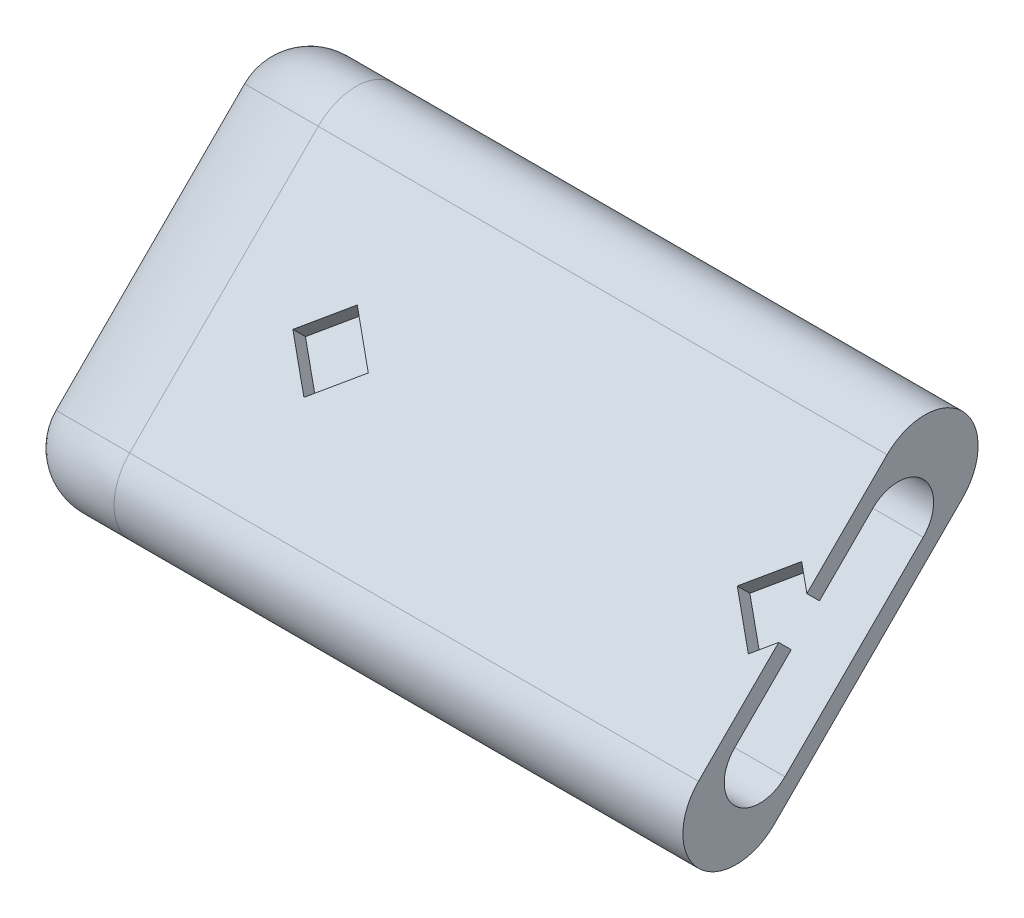
ISO-10303-21;
HEADER;
FILE_DESCRIPTION(('STEP AP214'),'2;1');
FILE_NAME('part.step','',(''),(''),'','','');
FILE_SCHEMA(('AUTOMOTIVE_DESIGN { 1 0 10303 214 1 1 1 1 }'));
ENDSEC;
DATA;
#1=APPLICATION_CONTEXT('core data for automotive mechanical design processes');
#2=APPLICATION_PROTOCOL_DEFINITION('international standard','automotive_design',2000,#1);
#3=PRODUCT_CONTEXT('',#1,'mechanical');
#4=PRODUCT('Part','Part','',(#3));
#5=PRODUCT_RELATED_PRODUCT_CATEGORY('part','',(#4));
#6=PRODUCT_DEFINITION_FORMATION('','',#4);
#7=PRODUCT_DEFINITION_CONTEXT('part definition',#1,'design');
#8=PRODUCT_DEFINITION('design','',#6,#7);
#9=PRODUCT_DEFINITION_SHAPE('','',#8);
#10=(LENGTH_UNIT() NAMED_UNIT(*) SI_UNIT(.MILLI.,.METRE.));
#11=(NAMED_UNIT(*) PLANE_ANGLE_UNIT() SI_UNIT($,.RADIAN.));
#12=(NAMED_UNIT(*) SI_UNIT($,.STERADIAN.) SOLID_ANGLE_UNIT());
#13=UNCERTAINTY_MEASURE_WITH_UNIT(LENGTH_MEASURE(1.E-05),#10,'distance_accuracy_value','');
#14=(GEOMETRIC_REPRESENTATION_CONTEXT(3) GLOBAL_UNCERTAINTY_ASSIGNED_CONTEXT((#13)) GLOBAL_UNIT_ASSIGNED_CONTEXT((#10,
#11,#12)) REPRESENTATION_CONTEXT('',''));
#15=CARTESIAN_POINT('',(0.,0.,0.));
#16=DIRECTION('',(0.,0.,1.));
#17=DIRECTION('',(1.,0.,0.));
#18=AXIS2_PLACEMENT_3D('',#15,#16,#17);
#19=CARTESIAN_POINT('',(17.5,38.138785920236,59.1752126605359));
#20=DIRECTION('',(0.,-0.707106781186547,-0.707106781186548));
#21=DIRECTION('',(0.,0.707106781186548,-0.707106781186547));
#22=AXIS2_PLACEMENT_3D('',#19,#20,#21);
#23=PLANE('',#22);
#24=DIRECTION('',(0.707106781186548,-0.5,0.499999999999999));
#25=VECTOR('',#24,1.);
#26=CARTESIAN_POINT('',(25.3786796564404,48.7453876380342,48.5686109427377));
#27=LINE('',#26,#25);
#28=CARTESIAN_POINT('',(25.3786796564404,48.7453876380342,48.5686109427377));
#29=VERTEX_POINT('',#28);
#30=CARTESIAN_POINT('',(27.5,47.2453876380342,50.0686109427377));
#31=VERTEX_POINT('',#30);
#32=EDGE_CURVE('E375',#29,#31,#27,.T.);
#33=ORIENTED_EDGE('',*,*,#32,.F.);
#34=DIRECTION('',(-0.707106781186547,-0.500000000000001,0.5));
#35=VECTOR('',#34,1.);
#36=CARTESIAN_POINT('',(27.5,50.2453876380342,47.0686109427377));
#37=LINE('',#36,#35);
#38=CARTESIAN_POINT('',(27.5,50.2453876380342,47.0686109427377));
#39=VERTEX_POINT('',#38);
#40=EDGE_CURVE('E418',#39,#29,#37,.T.);
#41=ORIENTED_EDGE('',*,*,#40,.F.);
#42=DIRECTION('',(-0.707106781186547,0.5,-0.5));
#43=VECTOR('',#42,1.);
#44=CARTESIAN_POINT('',(29.6213203435596,48.7453876380342,48.5686109427377));
#45=LINE('',#44,#43);
#46=CARTESIAN_POINT('',(29.6213203435596,48.7453876380342,48.5686109427377));
#47=VERTEX_POINT('',#46);
#48=EDGE_CURVE('E420',#47,#39,#45,.T.);
#49=ORIENTED_EDGE('',*,*,#48,.F.);
#50=DIRECTION('',(0.707106781186547,0.500000000000001,-0.5));
#51=VECTOR('',#50,1.);
#52=CARTESIAN_POINT('',(27.5,47.2453876380342,50.0686109427377));
#53=LINE('',#52,#51);
#54=EDGE_CURVE('E223',#31,#47,#53,.T.);
#55=ORIENTED_EDGE('',*,*,#54,.F.);
#56=EDGE_LOOP('',(#33,#41,#49,#55));
#57=FACE_BOUND('',#56,.T.);
#58=DIRECTION('',(1.,0.,0.));
#59=VECTOR('',#58,1.);
#60=CARTESIAN_POINT('',(21.5,54.0486884969333,43.2653100838386));
#61=LINE('',#60,#59);
#62=CARTESIAN_POINT('',(21.5,54.0486884969334,43.2653100838386));
#63=VERTEX_POINT('',#62);
#64=CARTESIAN_POINT('',(53.5,54.0486884969333,43.2653100838386));
#65=VERTEX_POINT('',#64);
#66=EDGE_CURVE('E385',#63,#65,#61,.T.);
#67=ORIENTED_EDGE('',*,*,#66,.F.);
#68=DIRECTION('',(0.,-0.707106781186548,0.707106781186547));
#69=VECTOR('',#68,1.);
#70=CARTESIAN_POINT('',(21.5,54.0486884969333,43.2653100838386));
#71=LINE('',#70,#69);
#72=CARTESIAN_POINT('',(21.5,43.4420867791351,53.8719118016368));
#73=VERTEX_POINT('',#72);
#74=EDGE_CURVE('E11',#63,#73,#71,.T.);
#75=ORIENTED_EDGE('',*,*,#74,.T.);
#76=DIRECTION('',(1.,0.,0.));
#77=VECTOR('',#76,1.);
#78=CARTESIAN_POINT('',(21.5,43.4420867791351,53.8719118016368));
#79=LINE('',#78,#77);
#80=CARTESIAN_POINT('',(53.5,43.4420867791351,53.8719118016368));
#81=VERTEX_POINT('',#80);
#82=EDGE_CURVE('E45',#73,#81,#79,.T.);
#83=ORIENTED_EDGE('',*,*,#82,.T.);
#84=DIRECTION('',(0.,-0.707106781186548,0.707106781186547));
#85=VECTOR('',#84,1.);
#86=CARTESIAN_POINT('',(53.5,54.0486884969333,43.2653100838386));
#87=LINE('',#86,#85);
#88=CARTESIAN_POINT('',(53.5,47.9524944192208,49.3615041615511));
#89=VERTEX_POINT('',#88);
#90=EDGE_CURVE('E53',#89,#81,#87,.T.);
#91=ORIENTED_EDGE('',*,*,#90,.F.);
#92=DIRECTION('',(0.707106781186547,0.500000000000001,-0.5));
#93=VECTOR('',#92,1.);
#94=CARTESIAN_POINT('',(52.5,47.2453876380342,50.0686109427377));
#95=LINE('',#94,#93);
#96=CARTESIAN_POINT('',(52.5,47.2453876380342,50.0686109427377));
#97=VERTEX_POINT('',#96);
#98=EDGE_CURVE('E40',#97,#89,#95,.T.);
#99=ORIENTED_EDGE('',*,*,#98,.F.);
#100=DIRECTION('',(0.707106781186546,-0.500000000000001,0.500000000000001));
#101=VECTOR('',#100,1.);
#102=CARTESIAN_POINT('',(50.3786796564404,48.7453876380342,48.5686109427377));
#103=LINE('',#102,#101);
#104=CARTESIAN_POINT('',(50.3786796564404,48.7453876380342,48.5686109427377));
#105=VERTEX_POINT('',#104);
#106=EDGE_CURVE('E423',#105,#97,#103,.T.);
#107=ORIENTED_EDGE('',*,*,#106,.F.);
#108=DIRECTION('',(-0.707106781186548,-0.5,0.499999999999999));
#109=VECTOR('',#108,1.);
#110=CARTESIAN_POINT('',(52.5,50.2453876380342,47.0686109427377));
#111=LINE('',#110,#109);
#112=CARTESIAN_POINT('',(52.5,50.2453876380342,47.0686109427377));
#113=VERTEX_POINT('',#112);
#114=EDGE_CURVE('E425',#113,#105,#111,.T.);
#115=ORIENTED_EDGE('',*,*,#114,.F.);
#116=DIRECTION('',(-0.707106781186548,0.5,-0.5));
#117=VECTOR('',#116,1.);
#118=CARTESIAN_POINT('',(54.6213203435596,48.7453876380342,48.5686109427377));
#119=LINE('',#118,#117);
#120=CARTESIAN_POINT('',(53.5,49.5382808568477,47.7757177239242));
#121=VERTEX_POINT('',#120);
#122=EDGE_CURVE('E426',#121,#113,#119,.T.);
#123=ORIENTED_EDGE('',*,*,#122,.F.);
#124=EDGE_CURVE('E380',#65,#121,#87,.T.);
#125=ORIENTED_EDGE('',*,*,#124,.F.);
#126=EDGE_LOOP('',(#67,#75,#83,#91,#99,#107,#115,#123,#125));
#127=FACE_BOUND('',#126,.T.);
#128=ADVANCED_FACE('F37',(#57,#127),#23,.F.);
#129=CARTESIAN_POINT('',(16.5,-6.03087227902122,1.74730231817738));
#130=DIRECTION('',(0.,0.707106781186547,0.707106781186548));
#131=DIRECTION('',(0.,-0.707106781186548,0.707106781186547));
#132=AXIS2_PLACEMENT_3D('',#129,#130,#131);
#133=CYLINDRICAL_SURFACE('',#132,1.99999999975565);
#134=DIRECTION('',(0.,0.707106781186547,0.707106781186548));
#135=VECTOR('',#134,1.);
#136=CARTESIAN_POINT('',(18.4999999995113,-6.03087227850288,1.74730231765905));
#137=LINE('',#136,#135);
#138=CARTESIAN_POINT('',(18.4999999995113,12.9481068389103,20.7262814350723));
#139=VERTEX_POINT('',#138);
#140=CARTESIAN_POINT('',(18.4999999997556,39.1110577428126,46.8892323389746));
#141=VERTEX_POINT('',#140);
#142=EDGE_CURVE('E284',#139,#141,#137,.T.);
#143=ORIENTED_EDGE('',*,*,#142,.F.);
#144=CARTESIAN_POINT('',(16.5,12.948106838392,20.7262814355906));
#145=DIRECTION('',(0.,0.707106781186547,0.707106781186548));
#146=DIRECTION('',(0.,-0.707106781186548,0.707106781186547));
#147=AXIS2_PLACEMENT_3D('',#144,#145,#146);
#148=CIRCLE('',#147,1.99999999975565);
#149=CARTESIAN_POINT('',(14.5,12.9481068389103,20.7262814350723));
#150=VERTEX_POINT('',#149);
#151=EDGE_CURVE('E299',#139,#150,#148,.F.);
#152=ORIENTED_EDGE('',*,*,#151,.T.);
#153=DIRECTION('',(0.,0.707106781186547,0.707106781186548));
#154=VECTOR('',#153,1.);
#155=CARTESIAN_POINT('',(14.5,-6.03087227850288,1.74730231765905));
#156=LINE('',#155,#154);
#157=CARTESIAN_POINT('',(14.5000000002443,39.1110577428126,46.8892323389746));
#158=VERTEX_POINT('',#157);
#159=EDGE_CURVE('E275',#150,#158,#156,.T.);
#160=ORIENTED_EDGE('',*,*,#159,.T.);
#161=CARTESIAN_POINT('',(16.5,39.1110577422943,46.8892323394929));
#162=DIRECTION('',(0.,0.707106781186547,0.707106781186548));
#163=DIRECTION('',(0.,-0.707106781186548,0.707106781186547));
#164=AXIS2_PLACEMENT_3D('',#161,#162,#163);
#165=CIRCLE('',#164,1.99999999975565);
#166=EDGE_CURVE('E287',#141,#158,#165,.F.);
#167=ORIENTED_EDGE('',*,*,#166,.F.);
#168=EDGE_LOOP('',(#143,#152,#160,#167));
#169=FACE_BOUND('',#168,.T.);
#170=ADVANCED_FACE('F475',(#169),#133,.F.);
#171=CARTESIAN_POINT('',(18.4999999995113,-6.03087227850288,1.74730231765905));
#172=DIRECTION('',(1.,-3.14145615637227E-11,3.14145615637227E-11));
#173=DIRECTION('',(3.14145615637227E-11,1.,0.));
#174=AXIS2_PLACEMENT_3D('',#171,#172,#173);
#175=PLANE('',#174);
#176=DIRECTION('',(0.,0.707106781186547,0.707106781186548));
#177=VECTOR('',#176,1.);
#178=CARTESIAN_POINT('',(18.5,1.74730231610411,-6.03087227694793));
#179=LINE('',#178,#177);
#180=CARTESIAN_POINT('',(18.5,20.7262814335173,12.9481068404653));
#181=VERTEX_POINT('',#180);
#182=CARTESIAN_POINT('',(18.5,46.8892323374196,39.1110577443676));
#183=VERTEX_POINT('',#182);
#184=EDGE_CURVE('E288',#181,#183,#179,.T.);
#185=ORIENTED_EDGE('',*,*,#184,.F.);
#186=DIRECTION('',(-4.44268990194212E-11,-0.707106781186548,0.707106781186547));
#187=VECTOR('',#186,1.);
#188=CARTESIAN_POINT('',(18.4999999995113,12.9481068389103,20.7262814350723));
#189=LINE('',#188,#187);
#190=EDGE_CURVE('E267',#181,#139,#189,.T.);
#191=ORIENTED_EDGE('',*,*,#190,.T.);
#192=ORIENTED_EDGE('',*,*,#142,.T.);
#193=DIRECTION('',(2.22132918075765E-11,0.707106781186548,-0.707106781186547));
#194=VECTOR('',#193,1.);
#195=CARTESIAN_POINT('',(18.4999999997556,39.1110577428126,46.8892323389746));
#196=LINE('',#195,#194);
#197=EDGE_CURVE('E324',#183,#141,#196,.F.);
#198=ORIENTED_EDGE('',*,*,#197,.F.);
#199=EDGE_LOOP('',(#185,#191,#192,#198));
#200=FACE_BOUND('',#199,.T.);
#201=ADVANCED_FACE('F473',(#200),#175,.F.);
#202=CARTESIAN_POINT('',(16.5,1.74730231610411,-6.03087227694793));
#203=DIRECTION('',(0.,0.707106781186547,0.707106781186548));
#204=DIRECTION('',(0.,-0.707106781186548,0.707106781186547));
#205=AXIS2_PLACEMENT_3D('',#202,#203,#204);
#206=CYLINDRICAL_SURFACE('',#205,2.);
#207=DIRECTION('',(0.,0.707106781186547,0.707106781186548));
#208=VECTOR('',#207,1.);
#209=CARTESIAN_POINT('',(14.5,1.74730231610423,-6.03087227694805));
#210=LINE('',#209,#208);
#211=CARTESIAN_POINT('',(14.5,20.7262814335175,12.9481068404652));
#212=VERTEX_POINT('',#211);
#213=CARTESIAN_POINT('',(14.5,46.8892323374197,39.1110577443675));
#214=VERTEX_POINT('',#213);
#215=EDGE_CURVE('E291',#212,#214,#210,.T.);
#216=ORIENTED_EDGE('',*,*,#215,.F.);
#217=CARTESIAN_POINT('',(16.5,20.7262814335173,12.9481068404653));
#218=DIRECTION('',(0.,0.707106781186547,0.707106781186548));
#219=DIRECTION('',(0.,-0.707106781186548,0.707106781186547));
#220=AXIS2_PLACEMENT_3D('',#217,#218,#219);
#221=CIRCLE('',#220,2.);
#222=EDGE_CURVE('E303',#212,#181,#221,.F.);
#223=ORIENTED_EDGE('',*,*,#222,.T.);
#224=ORIENTED_EDGE('',*,*,#184,.T.);
#225=CARTESIAN_POINT('',(16.5,46.8892323374196,39.1110577443676));
#226=DIRECTION('',(0.,0.707106781186547,0.707106781186548));
#227=DIRECTION('',(0.,-0.707106781186548,0.707106781186547));
#228=AXIS2_PLACEMENT_3D('',#225,#226,#227);
#229=CIRCLE('',#228,2.);
#230=EDGE_CURVE('E327',#214,#183,#229,.F.);
#231=ORIENTED_EDGE('',*,*,#230,.F.);
#232=EDGE_LOOP('',(#216,#223,#224,#231));
#233=FACE_BOUND('',#232,.T.);
#234=ADVANCED_FACE('F481',(#233),#206,.F.);
#235=CARTESIAN_POINT('',(14.5,1.74730231610423,-6.03087227694805));
#236=DIRECTION('',(-1.,0.,0.));
#237=DIRECTION('',(0.,-1.,0.));
#238=AXIS2_PLACEMENT_3D('',#235,#236,#237);
#239=PLANE('',#238);
#240=ORIENTED_EDGE('',*,*,#159,.F.);
#241=DIRECTION('',(0.,0.707106781186548,-0.707106781186547));
#242=VECTOR('',#241,1.);
#243=CARTESIAN_POINT('',(14.5,20.7262814335174,12.9481068404652));
#244=LINE('',#243,#242);
#245=EDGE_CURVE('E306',#150,#212,#244,.T.);
#246=ORIENTED_EDGE('',*,*,#245,.T.);
#247=ORIENTED_EDGE('',*,*,#215,.T.);
#248=DIRECTION('',(2.22132918075761E-11,-0.707106781186548,0.707106781186547));
#249=VECTOR('',#248,1.);
#250=CARTESIAN_POINT('',(14.5,46.8892323374197,39.1110577443675));
#251=LINE('',#250,#249);
#252=EDGE_CURVE('E315',#158,#214,#251,.F.);
#253=ORIENTED_EDGE('',*,*,#252,.F.);
#254=EDGE_LOOP('',(#240,#246,#247,#253));
#255=FACE_BOUND('',#254,.T.);
#256=ADVANCED_FACE('F478',(#255),#239,.F.);
#257=CARTESIAN_POINT('',(19.5,22.2288833435387,11.4455049304439));
#258=DIRECTION('',(1.,0.,0.));
#259=DIRECTION('',(0.,1.,0.));
#260=AXIS2_PLACEMENT_3D('',#257,#258,#259);
#261=PLANE('',#260);
#262=DIRECTION('',(0.,0.707106781186548,-0.707106781186547));
#263=VECTOR('',#262,1.);
#264=CARTESIAN_POINT('',(19.5,37.7852325296428,48.2150575521444));
#265=LINE('',#264,#263);
#266=CARTESIAN_POINT('',(19.5,37.7852325296428,48.2150575521444));
#267=VERTEX_POINT('',#266);
#268=CARTESIAN_POINT('',(19.5,48.391834247441,37.6084558343462));
#269=VERTEX_POINT('',#268);
#270=EDGE_CURVE('E321',#267,#269,#265,.T.);
#271=ORIENTED_EDGE('',*,*,#270,.F.);
#272=DIRECTION('',(0.,0.707106781186547,0.707106781186548));
#273=VECTOR('',#272,1.);
#274=CARTESIAN_POINT('',(19.5,-7.3566974916727,3.07312753082887));
#275=LINE('',#274,#273);
#276=CARTESIAN_POINT('',(19.5,11.6222816257405,22.0521066482421));
#277=VERTEX_POINT('',#276);
#278=EDGE_CURVE('E279',#277,#267,#275,.T.);
#279=ORIENTED_EDGE('',*,*,#278,.F.);
#280=DIRECTION('',(0.,-0.707106781186548,0.707106781186547));
#281=VECTOR('',#280,1.);
#282=CARTESIAN_POINT('',(19.5,22.2288833435387,11.4455049304439));
#283=LINE('',#282,#281);
#284=CARTESIAN_POINT('',(19.5,22.2288833435387,11.4455049304439));
#285=VERTEX_POINT('',#284);
#286=EDGE_CURVE('E298',#285,#277,#283,.T.);
#287=ORIENTED_EDGE('',*,*,#286,.F.);
#288=DIRECTION('',(0.,0.707106781186547,0.707106781186548));
#289=VECTOR('',#288,1.);
#290=CARTESIAN_POINT('',(19.5,3.24990422612552,-7.53347418696933));
#291=LINE('',#290,#289);
#292=EDGE_CURVE('E270',#285,#269,#291,.T.);
#293=ORIENTED_EDGE('',*,*,#292,.T.);
#294=EDGE_LOOP('',(#271,#279,#287,#293));
#295=FACE_BOUND('',#294,.T.);
#296=ADVANCED_FACE('F485',(#295),#261,.T.);
#297=CARTESIAN_POINT('',(14.5,11.5338932780922,22.1404949958904));
#298=DIRECTION('',(0.,0.707106781186547,0.707106781186548));
#299=DIRECTION('',(1.,0.,0.));
#300=AXIS2_PLACEMENT_3D('',#297,#298,#299);
#301=PLANE('',#300);
#302=CARTESIAN_POINT('',(16.5,22.2288833435387,11.4455049304439));
#303=DIRECTION('',(0.,0.707106781186547,0.707106781186548));
#304=DIRECTION('',(0.,-0.707106781186548,0.707106781186547));
#305=AXIS2_PLACEMENT_3D('',#302,#303,#304);
#306=CIRCLE('',#305,3.);
#307=CARTESIAN_POINT('',(13.5,22.2288833435387,11.4455049304439));
#308=VERTEX_POINT('',#307);
#309=EDGE_CURVE('E296',#308,#285,#306,.F.);
#310=ORIENTED_EDGE('',*,*,#309,.T.);
#311=ORIENTED_EDGE('',*,*,#286,.T.);
#312=CARTESIAN_POINT('',(16.5,11.6222816257405,22.0521066482421));
#313=DIRECTION('',(0.,0.707106781186547,0.707106781186548));
#314=DIRECTION('',(0.,-0.707106781186548,0.707106781186547));
#315=AXIS2_PLACEMENT_3D('',#312,#313,#314);
#316=CIRCLE('',#315,3.);
#317=CARTESIAN_POINT('',(13.5,11.6222816257405,22.0521066482421));
#318=VERTEX_POINT('',#317);
#319=EDGE_CURVE('E271',#277,#318,#316,.F.);
#320=ORIENTED_EDGE('',*,*,#319,.T.);
#321=DIRECTION('',(0.,0.707106781186548,-0.707106781186547));
#322=VECTOR('',#321,1.);
#323=CARTESIAN_POINT('',(13.5,22.2288833435387,11.4455049304439));
#324=LINE('',#323,#322);
#325=EDGE_CURVE('E266',#318,#308,#324,.T.);
#326=ORIENTED_EDGE('',*,*,#325,.T.);
#327=EDGE_LOOP('',(#310,#311,#320,#326));
#328=FACE_BOUND('',#327,.T.);
#329=ORIENTED_EDGE('',*,*,#190,.F.);
#330=ORIENTED_EDGE('',*,*,#222,.F.);
#331=ORIENTED_EDGE('',*,*,#245,.F.);
#332=ORIENTED_EDGE('',*,*,#151,.F.);
#333=EDGE_LOOP('',(#329,#330,#331,#332));
#334=FACE_BOUND('',#333,.T.);
#335=ADVANCED_FACE('F483',(#328,#334),#301,.F.);
#336=CARTESIAN_POINT('',(21.5,39.1110577422942,46.8892323394929));
#337=DIRECTION('',(0.,0.707106781186548,-0.707106781186547));
#338=DIRECTION('',(0.,0.707106781186547,0.707106781186548));
#339=AXIS2_PLACEMENT_3D('',#336,#337,#338);
#340=TOROIDAL_SURFACE('',#339,5.,1.99999999975565);
#341=CARTESIAN_POINT('',(21.5,39.1110577428126,46.8892323389746));
#342=DIRECTION('',(0.,0.707106781186548,-0.707106781186547));
#343=DIRECTION('',(-1.,0.,0.));
#344=AXIS2_PLACEMENT_3D('',#341,#342,#343);
#345=CIRCLE('',#344,3.00000000024435);
#346=CARTESIAN_POINT('',(21.5,41.232378086545,49.010552682707));
#347=VERTEX_POINT('',#346);
#348=EDGE_CURVE('E365',#141,#347,#345,.T.);
#349=ORIENTED_EDGE('',*,*,#348,.F.);
#350=ORIENTED_EDGE('',*,*,#166,.T.);
#351=CARTESIAN_POINT('',(21.5,39.1110577428126,46.8892323389746));
#352=DIRECTION('',(0.,0.707106781186548,-0.707106781186547));
#353=DIRECTION('',(-1.,0.,0.));
#354=AXIS2_PLACEMENT_3D('',#351,#352,#353);
#355=CIRCLE('',#354,6.99999999975565);
#356=CARTESIAN_POINT('',(21.5,44.0608052109456,51.8389798071076));
#357=VERTEX_POINT('',#356);
#358=EDGE_CURVE('E336',#158,#357,#355,.T.);
#359=ORIENTED_EDGE('',*,*,#358,.T.);
#360=CARTESIAN_POINT('',(21.5,42.646591648227,50.4247662454256));
#361=DIRECTION('',(1.,0.,0.));
#362=DIRECTION('',(0.,-0.707106781186548,0.707106781186547));
#363=AXIS2_PLACEMENT_3D('',#360,#361,#362);
#364=CIRCLE('',#363,1.99999999975565);
#365=EDGE_CURVE('E352',#347,#357,#364,.F.);
#366=ORIENTED_EDGE('',*,*,#365,.F.);
#367=EDGE_LOOP('',(#349,#350,#359,#366));
#368=FACE_BOUND('',#367,.T.);
#369=ADVANCED_FACE('F467',(#368),#340,.F.);
#370=CARTESIAN_POINT('',(21.5,41.8793807927129,44.1209092890743));
#371=DIRECTION('',(0.,0.707106781186548,-0.707106781186547));
#372=DIRECTION('',(0.,0.707106781186547,0.707106781186548));
#373=AXIS2_PLACEMENT_3D('',#370,#371,#372);
#374=CYLINDRICAL_SURFACE('',#373,3.00000000012217);
#375=CARTESIAN_POINT('',(21.5,46.8892323374196,39.1110577443676));
#376=DIRECTION('',(0.,0.707106781186548,-0.707106781186547));
#377=DIRECTION('',(-1.,0.,0.));
#378=AXIS2_PLACEMENT_3D('',#375,#376,#377);
#379=CIRCLE('',#378,3.);
#380=CARTESIAN_POINT('',(21.5,49.0105526809792,41.2323780879272));
#381=VERTEX_POINT('',#380);
#382=EDGE_CURVE('E355',#183,#381,#379,.T.);
#383=ORIENTED_EDGE('',*,*,#382,.F.);
#384=ORIENTED_EDGE('',*,*,#197,.T.);
#385=ORIENTED_EDGE('',*,*,#348,.T.);
#386=DIRECTION('',(0.,0.707106781170841,-0.707106781202254));
#387=VECTOR('',#386,1.);
#388=CARTESIAN_POINT('',(21.5,41.232378086545,49.010552682707));
#389=LINE('',#388,#387);
#390=EDGE_CURVE('E357',#381,#347,#389,.F.);
#391=ORIENTED_EDGE('',*,*,#390,.F.);
#392=EDGE_LOOP('',(#383,#384,#385,#391));
#393=FACE_BOUND('',#392,.T.);
#394=ADVANCED_FACE('F465',(#393),#374,.T.);
#395=CARTESIAN_POINT('',(21.5,46.8892323374196,39.1110577443676));
#396=DIRECTION('',(0.,0.707106781186548,-0.707106781186547));
#397=DIRECTION('',(0.,0.707106781186547,0.707106781186548));
#398=AXIS2_PLACEMENT_3D('',#395,#396,#397);
#399=TOROIDAL_SURFACE('',#398,5.,2.);
#400=CARTESIAN_POINT('',(21.5,46.8892323374197,39.1110577443675));
#401=DIRECTION('',(0.,0.707106781186548,-0.707106781186547));
#402=DIRECTION('',(-1.,0.,0.));
#403=AXIS2_PLACEMENT_3D('',#400,#401,#402);
#404=CIRCLE('',#403,7.);
#405=CARTESIAN_POINT('',(21.5,51.8389798057255,44.0608052126733));
#406=VERTEX_POINT('',#405);
#407=EDGE_CURVE('E335',#214,#406,#404,.T.);
#408=ORIENTED_EDGE('',*,*,#407,.F.);
#409=ORIENTED_EDGE('',*,*,#230,.T.);
#410=ORIENTED_EDGE('',*,*,#382,.T.);
#411=CARTESIAN_POINT('',(21.5,50.4247662433523,42.6465916503003));
#412=DIRECTION('',(1.,0.,0.));
#413=DIRECTION('',(0.,-0.707106781186548,0.707106781186547));
#414=AXIS2_PLACEMENT_3D('',#411,#412,#413);
#415=CIRCLE('',#414,2.);
#416=EDGE_CURVE('E338',#406,#381,#415,.F.);
#417=ORIENTED_EDGE('',*,*,#416,.F.);
#418=EDGE_LOOP('',(#408,#409,#410,#417));
#419=FACE_BOUND('',#418,.T.);
#420=ADVANCED_FACE('F457',(#419),#399,.F.);
#421=CARTESIAN_POINT('',(21.5,41.8793807927129,44.1209092890743));
#422=DIRECTION('',(0.,0.707106781186548,-0.707106781186547));
#423=DIRECTION('',(0.,0.707106781186547,0.707106781186548));
#424=AXIS2_PLACEMENT_3D('',#421,#422,#423);
#425=CYLINDRICAL_SURFACE('',#424,6.99999999987782);
#426=ORIENTED_EDGE('',*,*,#358,.F.);
#427=ORIENTED_EDGE('',*,*,#252,.T.);
#428=ORIENTED_EDGE('',*,*,#407,.T.);
#429=DIRECTION('',(0.,-0.707106781202255,0.70710678117084));
#430=VECTOR('',#429,1.);
#431=CARTESIAN_POINT('',(21.5,51.8389798057255,44.0608052126733));
#432=LINE('',#431,#430);
#433=EDGE_CURVE('E332',#357,#406,#432,.F.);
#434=ORIENTED_EDGE('',*,*,#433,.F.);
#435=EDGE_LOOP('',(#426,#427,#428,#434));
#436=FACE_BOUND('',#435,.T.);
#437=ADVANCED_FACE('F449',(#436),#425,.F.);
#438=CARTESIAN_POINT('',(16.5,3.24990422612552,-7.53347418696933));
#439=DIRECTION('',(0.,0.707106781186547,0.707106781186548));
#440=DIRECTION('',(0.,-0.707106781186548,0.707106781186547));
#441=AXIS2_PLACEMENT_3D('',#438,#439,#440);
#442=CYLINDRICAL_SURFACE('',#441,3.);
#443=ORIENTED_EDGE('',*,*,#309,.F.);
#444=DIRECTION('',(0.,0.707106781186547,0.707106781186548));
#445=VECTOR('',#444,1.);
#446=CARTESIAN_POINT('',(13.5,3.24990422612551,-7.53347418696933));
#447=LINE('',#446,#445);
#448=CARTESIAN_POINT('',(13.5,48.391834247441,37.6084558343462));
#449=VERTEX_POINT('',#448);
#450=EDGE_CURVE('E272',#308,#449,#447,.T.);
#451=ORIENTED_EDGE('',*,*,#450,.T.);
#452=CARTESIAN_POINT('',(16.5,48.391834247441,37.6084558343462));
#453=DIRECTION('',(0.,0.707106781186547,0.707106781186548));
#454=DIRECTION('',(0.,-0.707106781186548,0.707106781186547));
#455=AXIS2_PLACEMENT_3D('',#452,#453,#454);
#456=CIRCLE('',#455,3.);
#457=EDGE_CURVE('E318',#269,#449,#456,.T.);
#458=ORIENTED_EDGE('',*,*,#457,.F.);
#459=ORIENTED_EDGE('',*,*,#292,.F.);
#460=EDGE_LOOP('',(#443,#451,#458,#459));
#461=FACE_BOUND('',#460,.T.);
#462=ADVANCED_FACE('F554',(#461),#442,.T.);
#463=CARTESIAN_POINT('',(21.5,41.8793807927129,44.1209092890743));
#464=DIRECTION('',(0.,0.707106781186548,-0.707106781186547));
#465=DIRECTION('',(0.,0.707106781186547,0.707106781186548));
#466=AXIS2_PLACEMENT_3D('',#463,#464,#465);
#467=CYLINDRICAL_SURFACE('',#466,2.);
#468=CARTESIAN_POINT('',(21.5,48.391834247441,37.6084558343462));
#469=DIRECTION('',(0.,0.707106781186548,-0.707106781186547));
#470=DIRECTION('',(-1.,0.,0.));
#471=AXIS2_PLACEMENT_3D('',#468,#469,#470);
#472=CIRCLE('',#471,2.);
#473=CARTESIAN_POINT('',(21.5,49.8060478098141,39.0226693967193));
#474=VERTEX_POINT('',#473);
#475=EDGE_CURVE('E391',#269,#474,#472,.T.);
#476=ORIENTED_EDGE('',*,*,#475,.T.);
#477=DIRECTION('',(0.,0.707106781186548,-0.707106781186547));
#478=VECTOR('',#477,1.);
#479=CARTESIAN_POINT('',(21.5,39.1994460920158,49.6292711145175));
#480=LINE('',#479,#478);
#481=CARTESIAN_POINT('',(21.5,39.1994460920158,49.6292711145175));
#482=VERTEX_POINT('',#481);
#483=EDGE_CURVE('E388',#482,#474,#480,.T.);
#484=ORIENTED_EDGE('',*,*,#483,.F.);
#485=CARTESIAN_POINT('',(21.5,37.7852325296427,48.2150575521444));
#486=DIRECTION('',(0.,0.707106781186548,-0.707106781186547));
#487=DIRECTION('',(-1.,0.,0.));
#488=AXIS2_PLACEMENT_3D('',#485,#486,#487);
#489=CIRCLE('',#488,1.99999999999999);
#490=EDGE_CURVE('E387',#267,#482,#489,.T.);
#491=ORIENTED_EDGE('',*,*,#490,.F.);
#492=ORIENTED_EDGE('',*,*,#270,.T.);
#493=EDGE_LOOP('',(#476,#484,#491,#492));
#494=FACE_BOUND('',#493,.T.);
#495=ADVANCED_FACE('F538',(#494),#467,.F.);
#496=CARTESIAN_POINT('',(16.5,-7.35669749167271,3.07312753082888));
#497=DIRECTION('',(0.,0.707106781186547,0.707106781186548));
#498=DIRECTION('',(0.,-0.707106781186548,0.707106781186547));
#499=AXIS2_PLACEMENT_3D('',#496,#497,#498);
#500=CYLINDRICAL_SURFACE('',#499,3.);
#501=ORIENTED_EDGE('',*,*,#319,.F.);
#502=ORIENTED_EDGE('',*,*,#278,.T.);
#503=CARTESIAN_POINT('',(16.5,37.7852325296428,48.2150575521444));
#504=DIRECTION('',(0.,0.707106781186547,0.707106781186548));
#505=DIRECTION('',(0.,-0.707106781186548,0.707106781186547));
#506=AXIS2_PLACEMENT_3D('',#503,#504,#505);
#507=CIRCLE('',#506,3.);
#508=CARTESIAN_POINT('',(13.5,37.7852325296428,48.2150575521444));
#509=VERTEX_POINT('',#508);
#510=EDGE_CURVE('E311',#509,#267,#507,.T.);
#511=ORIENTED_EDGE('',*,*,#510,.F.);
#512=DIRECTION('',(0.,0.707106781186547,0.707106781186548));
#513=VECTOR('',#512,1.);
#514=CARTESIAN_POINT('',(13.5,-7.3566974916727,3.07312753082887));
#515=LINE('',#514,#513);
#516=EDGE_CURVE('E276',#318,#509,#515,.T.);
#517=ORIENTED_EDGE('',*,*,#516,.F.);
#518=EDGE_LOOP('',(#501,#502,#511,#517));
#519=FACE_BOUND('',#518,.T.);
#520=ADVANCED_FACE('F518',(#519),#500,.T.);
#521=CARTESIAN_POINT('',(21.5,37.7852325296427,48.2150575521444));
#522=DIRECTION('',(0.,0.707106781186548,-0.707106781186547));
#523=DIRECTION('',(0.,0.707106781186547,0.707106781186548));
#524=AXIS2_PLACEMENT_3D('',#521,#522,#523);
#525=TOROIDAL_SURFACE('',#524,5.,3.);
#526=CARTESIAN_POINT('',(21.5,37.7852325296427,48.2150575521444));
#527=DIRECTION('',(0.,0.707106781186548,-0.707106781186547));
#528=DIRECTION('',(-1.,0.,0.));
#529=AXIS2_PLACEMENT_3D('',#526,#527,#528);
#530=CIRCLE('',#529,8.);
#531=EDGE_CURVE('E409',#509,#73,#530,.T.);
#532=ORIENTED_EDGE('',*,*,#531,.F.);
#533=ORIENTED_EDGE('',*,*,#510,.T.);
#534=ORIENTED_EDGE('',*,*,#490,.T.);
#535=CARTESIAN_POINT('',(21.5,41.3207664355755,51.7505914580771));
#536=DIRECTION('',(1.,0.,0.));
#537=DIRECTION('',(0.,-0.707106781186548,0.707106781186547));
#538=AXIS2_PLACEMENT_3D('',#535,#536,#537);
#539=CIRCLE('',#538,3.);
#540=EDGE_CURVE('E403',#73,#482,#539,.T.);
#541=ORIENTED_EDGE('',*,*,#540,.F.);
#542=EDGE_LOOP('',(#532,#533,#534,#541));
#543=FACE_BOUND('',#542,.T.);
#544=ADVANCED_FACE('F516',(#543),#525,.T.);
#545=CARTESIAN_POINT('',(21.5,42.646591648227,50.4247662454256));
#546=DIRECTION('',(1.,0.,0.));
#547=DIRECTION('',(0.,0.,-1.));
#548=AXIS2_PLACEMENT_3D('',#545,#546,#547);
#549=CYLINDRICAL_SURFACE('',#548,1.99999999975565);
#550=CARTESIAN_POINT('',(53.5,42.646591648227,50.4247662454256));
#551=DIRECTION('',(1.,0.,0.));
#552=DIRECTION('',(0.,-0.707106781186548,0.707106781186547));
#553=AXIS2_PLACEMENT_3D('',#550,#551,#552);
#554=CIRCLE('',#553,1.99999999975565);
#555=CARTESIAN_POINT('',(53.5,41.232378086545,49.010552682707));
#556=VERTEX_POINT('',#555);
#557=CARTESIAN_POINT('',(53.5,44.0608052109456,51.8389798071076));
#558=VERTEX_POINT('',#557);
#559=EDGE_CURVE('E371',#556,#558,#554,.F.);
#560=ORIENTED_EDGE('',*,*,#559,.F.);
#561=DIRECTION('',(1.,0.,0.));
#562=VECTOR('',#561,1.);
#563=CARTESIAN_POINT('',(21.5,41.232378086545,49.010552682707));
#564=LINE('',#563,#562);
#565=EDGE_CURVE('E368',#347,#556,#564,.T.);
#566=ORIENTED_EDGE('',*,*,#565,.F.);
#567=ORIENTED_EDGE('',*,*,#365,.T.);
#568=DIRECTION('',(1.,0.,0.));
#569=VECTOR('',#568,1.);
#570=CARTESIAN_POINT('',(21.5,44.0608052109456,51.8389798071076));
#571=LINE('',#570,#569);
#572=EDGE_CURVE('E349',#357,#558,#571,.T.);
#573=ORIENTED_EDGE('',*,*,#572,.T.);
#574=EDGE_LOOP('',(#560,#566,#567,#573));
#575=FACE_BOUND('',#574,.T.);
#576=ADVANCED_FACE('F443',(#575),#549,.F.);
#577=CARTESIAN_POINT('',(21.5,41.232378086545,49.010552682707));
#578=DIRECTION('',(0.,0.707106781202254,0.707106781170841));
#579=DIRECTION('',(0.,-0.707106781170841,0.707106781202254));
#580=AXIS2_PLACEMENT_3D('',#577,#578,#579);
#581=PLANE('',#580);
#582=ORIENTED_EDGE('',*,*,#565,.T.);
#583=DIRECTION('',(0.,0.707106781170841,-0.707106781202254));
#584=VECTOR('',#583,1.);
#585=CARTESIAN_POINT('',(53.5,41.232378086545,49.010552682707));
#586=LINE('',#585,#584);
#587=CARTESIAN_POINT('',(53.5,49.0105526809792,41.2323780879272));
#588=VERTEX_POINT('',#587);
#589=EDGE_CURVE('E362',#588,#556,#586,.F.);
#590=ORIENTED_EDGE('',*,*,#589,.F.);
#591=DIRECTION('',(1.,0.,0.));
#592=VECTOR('',#591,1.);
#593=CARTESIAN_POINT('',(21.5,49.0105526809792,41.2323780879272));
#594=LINE('',#593,#592);
#595=EDGE_CURVE('E359',#381,#588,#594,.T.);
#596=ORIENTED_EDGE('',*,*,#595,.F.);
#597=ORIENTED_EDGE('',*,*,#390,.T.);
#598=EDGE_LOOP('',(#582,#590,#596,#597));
#599=FACE_BOUND('',#598,.T.);
#600=ADVANCED_FACE('F464',(#599),#581,.T.);
#601=CARTESIAN_POINT('',(21.5,50.4247662433523,42.6465916503003));
#602=DIRECTION('',(1.,0.,0.));
#603=DIRECTION('',(0.,0.,-1.));
#604=AXIS2_PLACEMENT_3D('',#601,#602,#603);
#605=CYLINDRICAL_SURFACE('',#604,2.);
#606=ORIENTED_EDGE('',*,*,#595,.T.);
#607=CARTESIAN_POINT('',(53.5,50.4247662433523,42.6465916503003));
#608=DIRECTION('',(1.,0.,0.));
#609=DIRECTION('',(0.,-0.707106781186548,0.707106781186547));
#610=AXIS2_PLACEMENT_3D('',#607,#608,#609);
#611=CIRCLE('',#610,2.);
#612=CARTESIAN_POINT('',(53.5,51.8389798057255,44.0608052126733));
#613=VERTEX_POINT('',#612);
#614=EDGE_CURVE('E348',#613,#588,#611,.F.);
#615=ORIENTED_EDGE('',*,*,#614,.F.);
#616=DIRECTION('',(1.,0.,0.));
#617=VECTOR('',#616,1.);
#618=CARTESIAN_POINT('',(21.5,51.8389798057255,44.0608052126733));
#619=LINE('',#618,#617);
#620=EDGE_CURVE('E344',#406,#613,#619,.T.);
#621=ORIENTED_EDGE('',*,*,#620,.F.);
#622=ORIENTED_EDGE('',*,*,#416,.T.);
#623=EDGE_LOOP('',(#606,#615,#621,#622));
#624=FACE_BOUND('',#623,.T.);
#625=ADVANCED_FACE('F455',(#624),#605,.F.);
#626=CARTESIAN_POINT('',(21.5,51.9273681533737,41.1439897402789));
#627=DIRECTION('',(1.,0.,0.));
#628=DIRECTION('',(0.,0.,-1.));
#629=AXIS2_PLACEMENT_3D('',#626,#627,#628);
#630=CYLINDRICAL_SURFACE('',#629,3.);
#631=ORIENTED_EDGE('',*,*,#66,.T.);
#632=CARTESIAN_POINT('',(53.5,51.9273681533737,41.1439897402789));
#633=DIRECTION('',(1.,0.,0.));
#634=DIRECTION('',(0.,-0.707106781186548,0.707106781186547));
#635=AXIS2_PLACEMENT_3D('',#632,#633,#634);
#636=CIRCLE('',#635,3.);
#637=CARTESIAN_POINT('',(53.5,49.8060478098141,39.0226693967193));
#638=VERTEX_POINT('',#637);
#639=EDGE_CURVE('E382',#638,#65,#636,.T.);
#640=ORIENTED_EDGE('',*,*,#639,.F.);
#641=DIRECTION('',(1.,0.,0.));
#642=VECTOR('',#641,1.);
#643=CARTESIAN_POINT('',(21.5,49.8060478098141,39.0226693967193));
#644=LINE('',#643,#642);
#645=EDGE_CURVE('E397',#474,#638,#644,.T.);
#646=ORIENTED_EDGE('',*,*,#645,.F.);
#647=CARTESIAN_POINT('',(21.5,51.9273681533737,41.1439897402789));
#648=DIRECTION('',(1.,0.,0.));
#649=DIRECTION('',(0.,-0.707106781186548,0.707106781186547));
#650=AXIS2_PLACEMENT_3D('',#647,#648,#649);
#651=CIRCLE('',#650,3.);
#652=EDGE_CURVE('E394',#474,#63,#651,.T.);
#653=ORIENTED_EDGE('',*,*,#652,.T.);
#654=EDGE_LOOP('',(#631,#640,#646,#653));
#655=FACE_BOUND('',#654,.T.);
#656=ADVANCED_FACE('F515',(#655),#630,.T.);
#657=CARTESIAN_POINT('',(21.5,39.1994460920158,49.6292711145175));
#658=DIRECTION('',(0.,-0.707106781186547,-0.707106781186548));
#659=DIRECTION('',(0.,0.707106781186548,-0.707106781186547));
#660=AXIS2_PLACEMENT_3D('',#657,#658,#659);
#661=PLANE('',#660);
#662=ORIENTED_EDGE('',*,*,#645,.T.);
#663=DIRECTION('',(0.,0.707106781186548,-0.707106781186547));
#664=VECTOR('',#663,1.);
#665=CARTESIAN_POINT('',(53.5,39.1994460920158,49.6292711145175));
#666=LINE('',#665,#664);
#667=CARTESIAN_POINT('',(53.5,39.1994460920158,49.6292711145175));
#668=VERTEX_POINT('',#667);
#669=EDGE_CURVE('E340',#668,#638,#666,.T.);
#670=ORIENTED_EDGE('',*,*,#669,.F.);
#671=DIRECTION('',(1.,0.,0.));
#672=VECTOR('',#671,1.);
#673=CARTESIAN_POINT('',(21.5,39.1994460920158,49.6292711145175));
#674=LINE('',#673,#672);
#675=EDGE_CURVE('E400',#482,#668,#674,.T.);
#676=ORIENTED_EDGE('',*,*,#675,.F.);
#677=ORIENTED_EDGE('',*,*,#483,.T.);
#678=EDGE_LOOP('',(#662,#670,#676,#677));
#679=FACE_BOUND('',#678,.T.);
#680=ADVANCED_FACE('F522',(#679),#661,.T.);
#681=CARTESIAN_POINT('',(21.5,41.3207664355755,51.7505914580771));
#682=DIRECTION('',(1.,0.,0.));
#683=DIRECTION('',(0.,0.,-1.));
#684=AXIS2_PLACEMENT_3D('',#681,#682,#683);
#685=CYLINDRICAL_SURFACE('',#684,3.);
#686=CARTESIAN_POINT('',(53.5,41.3207664355755,51.7505914580771));
#687=DIRECTION('',(1.,0.,0.));
#688=DIRECTION('',(0.,-0.707106781186548,0.707106781186547));
#689=AXIS2_PLACEMENT_3D('',#686,#687,#688);
#690=CIRCLE('',#689,3.);
#691=EDGE_CURVE('E378',#81,#668,#690,.T.);
#692=ORIENTED_EDGE('',*,*,#691,.F.);
#693=ORIENTED_EDGE('',*,*,#82,.F.);
#694=ORIENTED_EDGE('',*,*,#540,.T.);
#695=ORIENTED_EDGE('',*,*,#675,.T.);
#696=EDGE_LOOP('',(#692,#693,#694,#695));
#697=FACE_BOUND('',#696,.T.);
#698=ADVANCED_FACE('F520',(#697),#685,.T.);
#699=CARTESIAN_POINT('',(53.5,51.9273681533737,41.1439897402789));
#700=DIRECTION('',(1.,0.,0.));
#701=DIRECTION('',(0.,-0.707106781186548,0.707106781186547));
#702=AXIS2_PLACEMENT_3D('',#699,#700,#701);
#703=PLANE('',#702);
#704=DIRECTION('',(0.,-0.707106781186547,-0.707106781186548));
#705=VECTOR('',#704,1.);
#706=CARTESIAN_POINT('',(53.5,45.8311740756611,47.2401838179915));
#707=LINE('',#706,#705);
#708=CARTESIAN_POINT('',(53.5,47.2453876379322,48.6543973802626));
#709=VERTEX_POINT('',#708);
#710=EDGE_CURVE('E264',#89,#709,#707,.T.);
#711=ORIENTED_EDGE('',*,*,#710,.F.);
#712=ORIENTED_EDGE('',*,*,#90,.T.);
#713=ORIENTED_EDGE('',*,*,#691,.T.);
#714=ORIENTED_EDGE('',*,*,#669,.T.);
#715=ORIENTED_EDGE('',*,*,#639,.T.);
#716=ORIENTED_EDGE('',*,*,#124,.T.);
#717=DIRECTION('',(0.,0.707106781186547,0.707106781186548));
#718=VECTOR('',#717,1.);
#719=CARTESIAN_POINT('',(53.5,47.416960513288,45.6543973803646));
#720=LINE('',#719,#718);
#721=CARTESIAN_POINT('',(53.5,48.8311740755943,47.0686109426709));
#722=VERTEX_POINT('',#721);
#723=EDGE_CURVE('E244',#722,#121,#720,.T.);
#724=ORIENTED_EDGE('',*,*,#723,.F.);
#725=DIRECTION('',(0.,-0.707106781202255,0.70710678117084));
#726=VECTOR('',#725,1.);
#727=CARTESIAN_POINT('',(53.5,51.8389798057255,44.0608052126733));
#728=LINE('',#727,#726);
#729=EDGE_CURVE('E345',#722,#613,#728,.F.);
#730=ORIENTED_EDGE('',*,*,#729,.T.);
#731=ORIENTED_EDGE('',*,*,#614,.T.);
#732=ORIENTED_EDGE('',*,*,#589,.T.);
#733=ORIENTED_EDGE('',*,*,#559,.T.);
#734=EDGE_CURVE('E341',#558,#709,#728,.F.);
#735=ORIENTED_EDGE('',*,*,#734,.T.);
#736=EDGE_LOOP('',(#711,#712,#713,#714,#715,#716,#724,#730,#731,#732,#733,#735));
#737=FACE_BOUND('',#736,.T.);
#738=ADVANCED_FACE('F438',(#737),#703,.T.);
#739=CARTESIAN_POINT('',(54.6213203435596,43.795640169644,43.6188634743474));
#740=DIRECTION('',(0.707106781186548,0.5,-0.5));
#741=DIRECTION('',(-0.577350269189626,0.816496580927726,0.));
#742=AXIS2_PLACEMENT_3D('',#739,#740,#741);
#743=PLANE('',#742);
#744=ORIENTED_EDGE('',*,*,#723,.T.);
#745=ORIENTED_EDGE('',*,*,#122,.T.);
#746=DIRECTION('',(0.,0.707106781186547,0.707106781186548));
#747=VECTOR('',#746,1.);
#748=CARTESIAN_POINT('',(52.5,45.295640169644,42.1188634743474));
#749=LINE('',#748,#747);
#750=CARTESIAN_POINT('',(52.5,49.5382808567966,46.3615041615));
#751=VERTEX_POINT('',#750);
#752=EDGE_CURVE('E249',#751,#113,#749,.T.);
#753=ORIENTED_EDGE('',*,*,#752,.F.);
#754=DIRECTION('',(-0.707106781186548,0.500000000011107,-0.499999999988893));
#755=VECTOR('',#754,1.);
#756=CARTESIAN_POINT('',(54.6213203436263,48.0382808567161,47.8615041615138));
#757=LINE('',#756,#755);
#758=EDGE_CURVE('E232',#722,#751,#757,.T.);
#759=ORIENTED_EDGE('',*,*,#758,.F.);
#760=EDGE_LOOP('',(#744,#745,#753,#759));
#761=FACE_BOUND('',#760,.T.);
#762=ADVANCED_FACE('F528',(#761),#743,.F.);
#763=CARTESIAN_POINT('',(29.6213203435596,43.795640169644,43.6188634743474));
#764=DIRECTION('',(0.707106781186548,0.5,-0.5));
#765=DIRECTION('',(-0.577350269189626,0.816496580927726,0.));
#766=AXIS2_PLACEMENT_3D('',#763,#764,#765);
#767=PLANE('',#766);
#768=DIRECTION('',(0.,0.707106781186547,0.707106781186548));
#769=VECTOR('',#768,1.);
#770=CARTESIAN_POINT('',(29.6213203435596,43.795640169644,43.6188634743474));
#771=LINE('',#770,#769);
#772=CARTESIAN_POINT('',(29.6213203435596,48.0382808567632,47.8615041614667));
#773=VERTEX_POINT('',#772);
#774=EDGE_CURVE('E210',#773,#47,#771,.T.);
#775=ORIENTED_EDGE('',*,*,#774,.T.);
#776=ORIENTED_EDGE('',*,*,#48,.T.);
#777=DIRECTION('',(0.,0.707106781186547,0.707106781186548));
#778=VECTOR('',#777,1.);
#779=CARTESIAN_POINT('',(27.5,45.295640169644,42.1188634743474));
#780=LINE('',#779,#778);
#781=CARTESIAN_POINT('',(27.5,49.5382808567966,46.3615041615));
#782=VERTEX_POINT('',#781);
#783=EDGE_CURVE('E212',#782,#39,#780,.T.);
#784=ORIENTED_EDGE('',*,*,#783,.F.);
#785=DIRECTION('',(-0.707106781186547,0.500000000011107,-0.499999999988893));
#786=VECTOR('',#785,1.);
#787=CARTESIAN_POINT('',(29.6213203436263,48.0382808567161,47.8615041615138));
#788=LINE('',#787,#786);
#789=EDGE_CURVE('E207',#773,#782,#788,.T.);
#790=ORIENTED_EDGE('',*,*,#789,.F.);
#791=EDGE_LOOP('',(#775,#776,#784,#790));
#792=FACE_BOUND('',#791,.T.);
#793=ADVANCED_FACE('F209',(#792),#767,.F.);
#794=CARTESIAN_POINT('',(21.5,51.8389798057255,44.0608052126733));
#795=DIRECTION('',(0.,-0.70710678117084,-0.707106781202255));
#796=DIRECTION('',(0.,0.707106781202255,-0.70710678117084));
#797=AXIS2_PLACEMENT_3D('',#794,#795,#796);
#798=PLANE('',#797);
#799=DIRECTION('',(0.707106781186547,0.500000000011107,-0.499999999988893));
#800=VECTOR('',#799,1.);
#801=CARTESIAN_POINT('',(27.4999999999334,46.5382808566828,49.3615041614805));
#802=LINE('',#801,#800);
#803=CARTESIAN_POINT('',(27.5,46.5382808567299,49.3615041614334));
#804=VERTEX_POINT('',#803);
#805=EDGE_CURVE('E221',#804,#773,#802,.T.);
#806=ORIENTED_EDGE('',*,*,#805,.T.);
#807=ORIENTED_EDGE('',*,*,#789,.T.);
#808=DIRECTION('',(-0.707106781186546,-0.500000000011108,0.499999999988894));
#809=VECTOR('',#808,1.);
#810=CARTESIAN_POINT('',(27.4999999999334,49.5382808567494,46.3615041615471));
#811=LINE('',#810,#809);
#812=CARTESIAN_POINT('',(25.3786796564404,48.0382808567632,47.8615041614667));
#813=VERTEX_POINT('',#812);
#814=EDGE_CURVE('E238',#782,#813,#811,.T.);
#815=ORIENTED_EDGE('',*,*,#814,.T.);
#816=DIRECTION('',(0.707106781186548,-0.500000000011106,0.499999999988893));
#817=VECTOR('',#816,1.);
#818=CARTESIAN_POINT('',(25.378679656507,48.0382808567161,47.8615041615138));
#819=LINE('',#818,#817);
#820=EDGE_CURVE('E228',#813,#804,#819,.T.);
#821=ORIENTED_EDGE('',*,*,#820,.T.);
#822=EDGE_LOOP('',(#806,#807,#815,#821));
#823=FACE_BOUND('',#822,.T.);
#824=DIRECTION('',(0.707106781186546,0.500000000011108,-0.499999999988894));
#825=VECTOR('',#824,1.);
#826=CARTESIAN_POINT('',(52.4999999999334,46.5382808566828,49.3615041614805));
#827=LINE('',#826,#825);
#828=CARTESIAN_POINT('',(52.5,46.5382808567299,49.3615041614334));
#829=VERTEX_POINT('',#828);
#830=EDGE_CURVE('E229',#829,#709,#827,.T.);
#831=ORIENTED_EDGE('',*,*,#830,.T.);
#832=ORIENTED_EDGE('',*,*,#734,.F.);
#833=ORIENTED_EDGE('',*,*,#572,.F.);
#834=ORIENTED_EDGE('',*,*,#433,.T.);
#835=ORIENTED_EDGE('',*,*,#620,.T.);
#836=ORIENTED_EDGE('',*,*,#729,.F.);
#837=ORIENTED_EDGE('',*,*,#758,.T.);
#838=DIRECTION('',(-0.707106781186548,-0.500000000011107,0.499999999988893));
#839=VECTOR('',#838,1.);
#840=CARTESIAN_POINT('',(52.4999999999334,49.5382808567494,46.3615041615472));
#841=LINE('',#840,#839);
#842=CARTESIAN_POINT('',(50.3786796564404,48.0382808567632,47.8615041614667));
#843=VERTEX_POINT('',#842);
#844=EDGE_CURVE('E252',#751,#843,#841,.T.);
#845=ORIENTED_EDGE('',*,*,#844,.T.);
#846=DIRECTION('',(0.707106781186546,-0.500000000011108,0.499999999988895));
#847=VECTOR('',#846,1.);
#848=CARTESIAN_POINT('',(50.378679656507,48.0382808567161,47.8615041615138));
#849=LINE('',#848,#847);
#850=EDGE_CURVE('E248',#843,#829,#849,.T.);
#851=ORIENTED_EDGE('',*,*,#850,.T.);
#852=EDGE_LOOP('',(#831,#832,#833,#834,#835,#836,#837,#845,#851));
#853=FACE_BOUND('',#852,.T.);
#854=ADVANCED_FACE('F226',(#823,#853),#798,.T.);
#855=CARTESIAN_POINT('',(27.5,42.295640169644,45.1188634743474));
#856=DIRECTION('',(0.707106781186548,-0.5,0.5));
#857=DIRECTION('',(0.577350269189626,0.816496580927726,0.));
#858=AXIS2_PLACEMENT_3D('',#855,#856,#857);
#859=PLANE('',#858);
#860=DIRECTION('',(0.,0.707106781186547,0.707106781186548));
#861=VECTOR('',#860,1.);
#862=CARTESIAN_POINT('',(27.5,42.295640169644,45.1188634743474));
#863=LINE('',#862,#861);
#864=EDGE_CURVE('E236',#804,#31,#863,.T.);
#865=ORIENTED_EDGE('',*,*,#864,.T.);
#866=ORIENTED_EDGE('',*,*,#54,.T.);
#867=ORIENTED_EDGE('',*,*,#774,.F.);
#868=ORIENTED_EDGE('',*,*,#805,.F.);
#869=EDGE_LOOP('',(#865,#866,#867,#868));
#870=FACE_BOUND('',#869,.T.);
#871=ADVANCED_FACE('F220',(#870),#859,.F.);
#872=CARTESIAN_POINT('',(27.5,45.295640169644,42.1188634743474));
#873=DIRECTION('',(-0.707106781186549,0.499999999999999,-0.499999999999999));
#874=DIRECTION('',(-0.577350269189625,-0.816496580927727,0.));
#875=AXIS2_PLACEMENT_3D('',#872,#873,#874);
#876=PLANE('',#875);
#877=ORIENTED_EDGE('',*,*,#783,.T.);
#878=ORIENTED_EDGE('',*,*,#40,.T.);
#879=DIRECTION('',(0.,0.707106781186547,0.707106781186548));
#880=VECTOR('',#879,1.);
#881=CARTESIAN_POINT('',(25.3786796564404,43.795640169644,43.6188634743474));
#882=LINE('',#881,#880);
#883=EDGE_CURVE('E237',#813,#29,#882,.T.);
#884=ORIENTED_EDGE('',*,*,#883,.F.);
#885=ORIENTED_EDGE('',*,*,#814,.F.);
#886=EDGE_LOOP('',(#877,#878,#884,#885));
#887=FACE_BOUND('',#886,.T.);
#888=ADVANCED_FACE('F728',(#887),#876,.F.);
#889=CARTESIAN_POINT('',(25.3786796564404,43.795640169644,43.6188634743474));
#890=DIRECTION('',(-0.707106781186547,-0.500000000000001,0.5));
#891=DIRECTION('',(0.577350269189627,-0.816496580927725,0.));
#892=AXIS2_PLACEMENT_3D('',#889,#890,#891);
#893=PLANE('',#892);
#894=ORIENTED_EDGE('',*,*,#883,.T.);
#895=ORIENTED_EDGE('',*,*,#32,.T.);
#896=ORIENTED_EDGE('',*,*,#864,.F.);
#897=ORIENTED_EDGE('',*,*,#820,.F.);
#898=EDGE_LOOP('',(#894,#895,#896,#897));
#899=FACE_BOUND('',#898,.T.);
#900=ADVANCED_FACE('F736',(#899),#893,.F.);
#901=CARTESIAN_POINT('',(52.5,42.295640169644,45.1188634743474));
#902=DIRECTION('',(0.707106781186548,-0.499999999999999,0.499999999999999));
#903=DIRECTION('',(0.577350269189625,0.816496580927727,0.));
#904=AXIS2_PLACEMENT_3D('',#901,#902,#903);
#905=PLANE('',#904);
#906=DIRECTION('',(0.,0.707106781186547,0.707106781186548));
#907=VECTOR('',#906,1.);
#908=CARTESIAN_POINT('',(52.5,42.295640169644,45.1188634743474));
#909=LINE('',#908,#907);
#910=EDGE_CURVE('E245',#829,#97,#909,.T.);
#911=ORIENTED_EDGE('',*,*,#910,.T.);
#912=ORIENTED_EDGE('',*,*,#98,.T.);
#913=ORIENTED_EDGE('',*,*,#710,.T.);
#914=ORIENTED_EDGE('',*,*,#830,.F.);
#915=EDGE_LOOP('',(#911,#912,#913,#914));
#916=FACE_BOUND('',#915,.T.);
#917=ADVANCED_FACE('F433',(#916),#905,.F.);
#918=CARTESIAN_POINT('',(52.5,45.295640169644,42.1188634743474));
#919=DIRECTION('',(-0.707106781186547,0.500000000000001,-0.5));
#920=DIRECTION('',(-0.577350269189627,-0.816496580927726,0.));
#921=AXIS2_PLACEMENT_3D('',#918,#919,#920);
#922=PLANE('',#921);
#923=ORIENTED_EDGE('',*,*,#752,.T.);
#924=ORIENTED_EDGE('',*,*,#114,.T.);
#925=DIRECTION('',(0.,0.707106781186547,0.707106781186548));
#926=VECTOR('',#925,1.);
#927=CARTESIAN_POINT('',(50.3786796564404,43.795640169644,43.6188634743474));
#928=LINE('',#927,#926);
#929=EDGE_CURVE('E253',#843,#105,#928,.T.);
#930=ORIENTED_EDGE('',*,*,#929,.F.);
#931=ORIENTED_EDGE('',*,*,#844,.F.);
#932=EDGE_LOOP('',(#923,#924,#930,#931));
#933=FACE_BOUND('',#932,.T.);
#934=ADVANCED_FACE('F753',(#933),#922,.F.);
#935=CARTESIAN_POINT('',(50.3786796564404,43.795640169644,43.6188634743474));
#936=DIRECTION('',(-0.707106781186549,-0.499999999999999,0.499999999999998));
#937=DIRECTION('',(0.577350269189624,-0.816496580927727,0.));
#938=AXIS2_PLACEMENT_3D('',#935,#936,#937);
#939=PLANE('',#938);
#940=ORIENTED_EDGE('',*,*,#929,.T.);
#941=ORIENTED_EDGE('',*,*,#106,.T.);
#942=ORIENTED_EDGE('',*,*,#910,.F.);
#943=ORIENTED_EDGE('',*,*,#850,.F.);
#944=EDGE_LOOP('',(#940,#941,#942,#943));
#945=FACE_BOUND('',#944,.T.);
#946=ADVANCED_FACE('F565',(#945),#939,.F.);
#947=CARTESIAN_POINT('',(13.5,3.24990422612551,-7.53347418696933));
#948=DIRECTION('',(-1.,0.,0.));
#949=DIRECTION('',(0.,-1.,0.));
#950=AXIS2_PLACEMENT_3D('',#947,#948,#949);
#951=PLANE('',#950);
#952=ORIENTED_EDGE('',*,*,#325,.F.);
#953=ORIENTED_EDGE('',*,*,#516,.T.);
#954=DIRECTION('',(0.,-0.707106781186548,0.707106781186547));
#955=VECTOR('',#954,1.);
#956=CARTESIAN_POINT('',(13.5,48.391834247441,37.6084558343462));
#957=LINE('',#956,#955);
#958=EDGE_CURVE('E314',#449,#509,#957,.T.);
#959=ORIENTED_EDGE('',*,*,#958,.F.);
#960=ORIENTED_EDGE('',*,*,#450,.F.);
#961=EDGE_LOOP('',(#952,#953,#959,#960));
#962=FACE_BOUND('',#961,.T.);
#963=ADVANCED_FACE('F510',(#962),#951,.T.);
#964=CARTESIAN_POINT('',(21.5,48.391834247441,37.6084558343462));
#965=DIRECTION('',(0.,0.707106781186548,-0.707106781186547));
#966=DIRECTION('',(0.,0.707106781186547,0.707106781186548));
#967=AXIS2_PLACEMENT_3D('',#964,#965,#966);
#968=TOROIDAL_SURFACE('',#967,5.,3.);
#969=ORIENTED_EDGE('',*,*,#475,.F.);
#970=ORIENTED_EDGE('',*,*,#457,.T.);
#971=CARTESIAN_POINT('',(21.5,48.391834247441,37.6084558343462));
#972=DIRECTION('',(0.,0.707106781186548,-0.707106781186547));
#973=DIRECTION('',(-1.,0.,0.));
#974=AXIS2_PLACEMENT_3D('',#971,#972,#973);
#975=CIRCLE('',#974,8.);
#976=EDGE_CURVE('E406',#449,#63,#975,.T.);
#977=ORIENTED_EDGE('',*,*,#976,.T.);
#978=ORIENTED_EDGE('',*,*,#652,.F.);
#979=EDGE_LOOP('',(#969,#970,#977,#978));
#980=FACE_BOUND('',#979,.T.);
#981=ADVANCED_FACE('F505',(#980),#968,.T.);
#982=CARTESIAN_POINT('',(21.5,41.8793807927129,44.1209092890743));
#983=DIRECTION('',(0.,0.707106781186548,-0.707106781186547));
#984=DIRECTION('',(0.,0.707106781186547,0.707106781186548));
#985=AXIS2_PLACEMENT_3D('',#982,#983,#984);
#986=CYLINDRICAL_SURFACE('',#985,8.);
#987=ORIENTED_EDGE('',*,*,#976,.F.);
#988=ORIENTED_EDGE('',*,*,#958,.T.);
#989=ORIENTED_EDGE('',*,*,#531,.T.);
#990=ORIENTED_EDGE('',*,*,#74,.F.);
#991=EDGE_LOOP('',(#987,#988,#989,#990));
#992=FACE_BOUND('',#991,.T.);
#993=ADVANCED_FACE('F498',(#992),#986,.T.);
#994=CLOSED_SHELL('',(#128,#170,#201,#234,#256,#296,#335,#369,#394,#420,#437,#462,#495,#520,
#544,#576,#600,#625,#656,#680,#698,#738,#762,#793,#854,#871,#888,#900,#917,#934,#946,#963,#981,#993));
#995=MANIFOLD_SOLID_BREP('B2',#994);
#996=ADVANCED_BREP_SHAPE_REPRESENTATION('',(#18,#995),#14);
#997=SHAPE_DEFINITION_REPRESENTATION(#9,#996);
ENDSEC;
END-ISO-10303-21;
